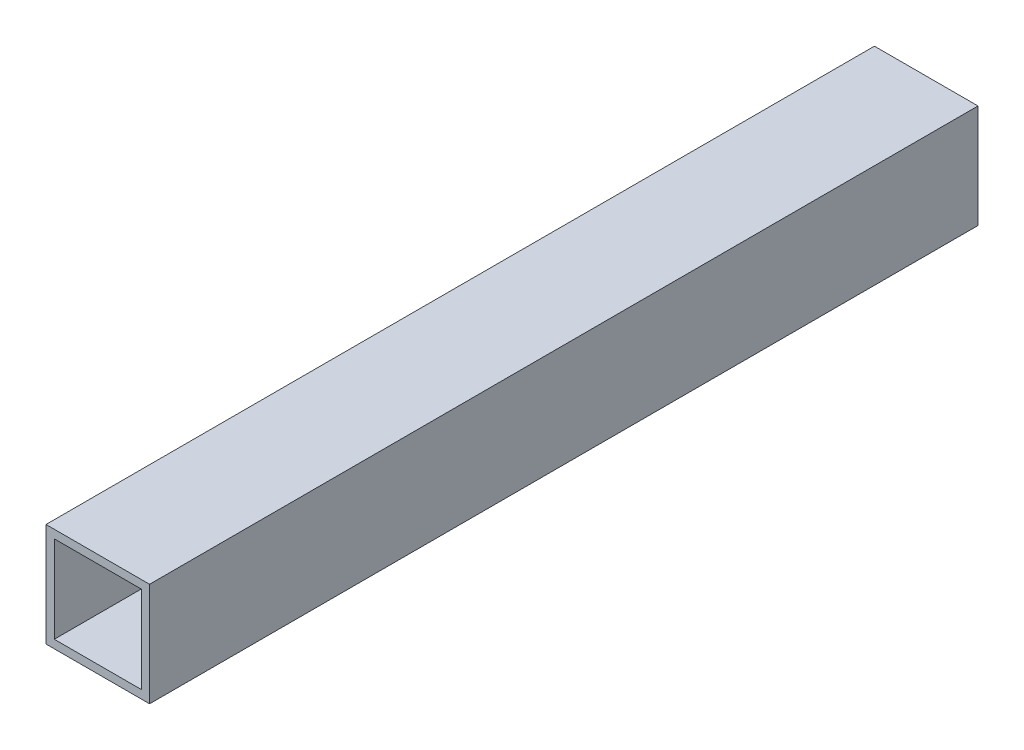
ISO-10303-21;
HEADER;
FILE_DESCRIPTION(('STEP AP214'),'2;1');
FILE_NAME('part.step','',(''),(''),'','','');
FILE_SCHEMA(('AUTOMOTIVE_DESIGN { 1 0 10303 214 1 1 1 1 }'));
ENDSEC;
DATA;
#1=APPLICATION_CONTEXT('core data for automotive mechanical design processes');
#2=APPLICATION_PROTOCOL_DEFINITION('international standard','automotive_design',2000,#1);
#3=PRODUCT_CONTEXT('',#1,'mechanical');
#4=PRODUCT('Part','Part','',(#3));
#5=PRODUCT_RELATED_PRODUCT_CATEGORY('part','',(#4));
#6=PRODUCT_DEFINITION_FORMATION('','',#4);
#7=PRODUCT_DEFINITION_CONTEXT('part definition',#1,'design');
#8=PRODUCT_DEFINITION('design','',#6,#7);
#9=PRODUCT_DEFINITION_SHAPE('','',#8);
#10=(LENGTH_UNIT() NAMED_UNIT(*) SI_UNIT(.MILLI.,.METRE.));
#11=(NAMED_UNIT(*) PLANE_ANGLE_UNIT() SI_UNIT($,.RADIAN.));
#12=(NAMED_UNIT(*) SI_UNIT($,.STERADIAN.) SOLID_ANGLE_UNIT());
#13=UNCERTAINTY_MEASURE_WITH_UNIT(LENGTH_MEASURE(1.E-05),#10,'distance_accuracy_value','');
#14=(GEOMETRIC_REPRESENTATION_CONTEXT(3) GLOBAL_UNCERTAINTY_ASSIGNED_CONTEXT((#13)) GLOBAL_UNIT_ASSIGNED_CONTEXT((#10,
#11,#12)) REPRESENTATION_CONTEXT('',''));
#15=CARTESIAN_POINT('',(0.,0.,0.));
#16=DIRECTION('',(0.,0.,1.));
#17=DIRECTION('',(1.,0.,0.));
#18=AXIS2_PLACEMENT_3D('',#15,#16,#17);
#19=CARTESIAN_POINT('',(0.,0.,200.));
#20=DIRECTION('',(0.,0.,-1.));
#21=DIRECTION('',(-1.,0.,0.));
#22=AXIS2_PLACEMENT_3D('',#19,#20,#21);
#23=PLANE('',#22);
#24=DIRECTION('',(0.,1.,0.));
#25=VECTOR('',#24,1.);
#26=CARTESIAN_POINT('',(12.5,-12.5,200.));
#27=LINE('',#26,#25);
#28=CARTESIAN_POINT('',(12.5,-12.5,200.));
#29=VERTEX_POINT('',#28);
#30=CARTESIAN_POINT('',(12.5,12.5,200.));
#31=VERTEX_POINT('',#30);
#32=EDGE_CURVE('E137',#29,#31,#27,.T.);
#33=ORIENTED_EDGE('',*,*,#32,.T.);
#34=DIRECTION('',(-1.,0.,0.));
#35=VECTOR('',#34,1.);
#36=CARTESIAN_POINT('',(-12.5,12.5,200.));
#37=LINE('',#36,#35);
#38=CARTESIAN_POINT('',(-12.5,12.5,200.));
#39=VERTEX_POINT('',#38);
#40=EDGE_CURVE('E140',#31,#39,#37,.T.);
#41=ORIENTED_EDGE('',*,*,#40,.T.);
#42=DIRECTION('',(0.,-1.,0.));
#43=VECTOR('',#42,1.);
#44=CARTESIAN_POINT('',(-12.5,-12.5,200.));
#45=LINE('',#44,#43);
#46=CARTESIAN_POINT('',(-12.5,-12.5,200.));
#47=VERTEX_POINT('',#46);
#48=EDGE_CURVE('E143',#39,#47,#45,.T.);
#49=ORIENTED_EDGE('',*,*,#48,.T.);
#50=DIRECTION('',(1.,0.,0.));
#51=VECTOR('',#50,1.);
#52=CARTESIAN_POINT('',(-12.5,-12.5,200.));
#53=LINE('',#52,#51);
#54=EDGE_CURVE('E145',#47,#29,#53,.T.);
#55=ORIENTED_EDGE('',*,*,#54,.T.);
#56=EDGE_LOOP('',(#33,#41,#49,#55));
#57=FACE_BOUND('',#56,.T.);
#58=DIRECTION('',(0.,1.,0.));
#59=VECTOR('',#58,1.);
#60=CARTESIAN_POINT('',(10.5,10.5,200.));
#61=LINE('',#60,#59);
#62=CARTESIAN_POINT('',(10.5,-10.5,200.));
#63=VERTEX_POINT('',#62);
#64=CARTESIAN_POINT('',(10.5,10.5,200.));
#65=VERTEX_POINT('',#64);
#66=EDGE_CURVE('E101',#63,#65,#61,.T.);
#67=ORIENTED_EDGE('',*,*,#66,.F.);
#68=DIRECTION('',(1.,0.,0.));
#69=VECTOR('',#68,1.);
#70=CARTESIAN_POINT('',(-10.5,-10.5,200.));
#71=LINE('',#70,#69);
#72=CARTESIAN_POINT('',(-10.5,-10.5,200.));
#73=VERTEX_POINT('',#72);
#74=EDGE_CURVE('E123',#73,#63,#71,.T.);
#75=ORIENTED_EDGE('',*,*,#74,.F.);
#76=DIRECTION('',(0.,-1.,0.));
#77=VECTOR('',#76,1.);
#78=CARTESIAN_POINT('',(-10.5,10.5,200.));
#79=LINE('',#78,#77);
#80=CARTESIAN_POINT('',(-10.5,10.5,200.));
#81=VERTEX_POINT('',#80);
#82=EDGE_CURVE('E121',#81,#73,#79,.T.);
#83=ORIENTED_EDGE('',*,*,#82,.F.);
#84=DIRECTION('',(-1.,0.,0.));
#85=VECTOR('',#84,1.);
#86=CARTESIAN_POINT('',(-10.5,10.5,200.));
#87=LINE('',#86,#85);
#88=EDGE_CURVE('E109',#65,#81,#87,.T.);
#89=ORIENTED_EDGE('',*,*,#88,.F.);
#90=EDGE_LOOP('',(#67,#75,#83,#89));
#91=FACE_BOUND('',#90,.T.);
#92=ADVANCED_FACE('F36',(#57,#91),#23,.F.);
#93=CARTESIAN_POINT('',(0.,0.,0.));
#94=DIRECTION('',(0.,0.,-1.));
#95=DIRECTION('',(-1.,0.,0.));
#96=AXIS2_PLACEMENT_3D('',#93,#94,#95);
#97=PLANE('',#96);
#98=DIRECTION('',(0.,1.,0.));
#99=VECTOR('',#98,1.);
#100=CARTESIAN_POINT('',(12.5,-12.5,0.));
#101=LINE('',#100,#99);
#102=CARTESIAN_POINT('',(12.5,-12.5,0.));
#103=VERTEX_POINT('',#102);
#104=CARTESIAN_POINT('',(12.5,12.5,0.));
#105=VERTEX_POINT('',#104);
#106=EDGE_CURVE('E117',#103,#105,#101,.T.);
#107=ORIENTED_EDGE('',*,*,#106,.F.);
#108=DIRECTION('',(1.,0.,0.));
#109=VECTOR('',#108,1.);
#110=CARTESIAN_POINT('',(-12.5,-12.5,0.));
#111=LINE('',#110,#109);
#112=CARTESIAN_POINT('',(-12.5,-12.5,0.));
#113=VERTEX_POINT('',#112);
#114=EDGE_CURVE('E141',#113,#103,#111,.T.);
#115=ORIENTED_EDGE('',*,*,#114,.F.);
#116=DIRECTION('',(0.,-1.,0.));
#117=VECTOR('',#116,1.);
#118=CARTESIAN_POINT('',(-12.5,-12.5,0.));
#119=LINE('',#118,#117);
#120=CARTESIAN_POINT('',(-12.5,12.5,0.));
#121=VERTEX_POINT('',#120);
#122=EDGE_CURVE('E152',#121,#113,#119,.T.);
#123=ORIENTED_EDGE('',*,*,#122,.F.);
#124=DIRECTION('',(-1.,0.,0.));
#125=VECTOR('',#124,1.);
#126=CARTESIAN_POINT('',(-12.5,12.5,0.));
#127=LINE('',#126,#125);
#128=EDGE_CURVE('E150',#105,#121,#127,.T.);
#129=ORIENTED_EDGE('',*,*,#128,.F.);
#130=EDGE_LOOP('',(#107,#115,#123,#129));
#131=FACE_BOUND('',#130,.T.);
#132=DIRECTION('',(1.,0.,0.));
#133=VECTOR('',#132,1.);
#134=CARTESIAN_POINT('',(-10.5,-10.5,0.));
#135=LINE('',#134,#133);
#136=CARTESIAN_POINT('',(-10.5,-10.5,0.));
#137=VERTEX_POINT('',#136);
#138=CARTESIAN_POINT('',(10.5,-10.5,0.));
#139=VERTEX_POINT('',#138);
#140=EDGE_CURVE('E110',#137,#139,#135,.T.);
#141=ORIENTED_EDGE('',*,*,#140,.T.);
#142=DIRECTION('',(0.,1.,0.));
#143=VECTOR('',#142,1.);
#144=CARTESIAN_POINT('',(10.5,10.5,0.));
#145=LINE('',#144,#143);
#146=CARTESIAN_POINT('',(10.5,10.5,0.));
#147=VERTEX_POINT('',#146);
#148=EDGE_CURVE('E59',#139,#147,#145,.T.);
#149=ORIENTED_EDGE('',*,*,#148,.T.);
#150=DIRECTION('',(-1.,0.,0.));
#151=VECTOR('',#150,1.);
#152=CARTESIAN_POINT('',(-10.5,10.5,0.));
#153=LINE('',#152,#151);
#154=CARTESIAN_POINT('',(-10.5,10.5,0.));
#155=VERTEX_POINT('',#154);
#156=EDGE_CURVE('E116',#147,#155,#153,.T.);
#157=ORIENTED_EDGE('',*,*,#156,.T.);
#158=DIRECTION('',(0.,-1.,0.));
#159=VECTOR('',#158,1.);
#160=CARTESIAN_POINT('',(-10.5,10.5,0.));
#161=LINE('',#160,#159);
#162=EDGE_CURVE('E129',#155,#137,#161,.T.);
#163=ORIENTED_EDGE('',*,*,#162,.T.);
#164=EDGE_LOOP('',(#141,#149,#157,#163));
#165=FACE_BOUND('',#164,.T.);
#166=ADVANCED_FACE('F170',(#131,#165),#97,.T.);
#167=CARTESIAN_POINT('',(12.5,-12.5,200.));
#168=DIRECTION('',(-1.,0.,0.));
#169=DIRECTION('',(0.,0.,1.));
#170=AXIS2_PLACEMENT_3D('',#167,#168,#169);
#171=PLANE('',#170);
#172=ORIENTED_EDGE('',*,*,#106,.T.);
#173=DIRECTION('',(0.,0.,-1.));
#174=VECTOR('',#173,1.);
#175=CARTESIAN_POINT('',(12.5,12.5,200.));
#176=LINE('',#175,#174);
#177=EDGE_CURVE('E11',#31,#105,#176,.T.);
#178=ORIENTED_EDGE('',*,*,#177,.F.);
#179=ORIENTED_EDGE('',*,*,#32,.F.);
#180=DIRECTION('',(0.,0.,-1.));
#181=VECTOR('',#180,1.);
#182=CARTESIAN_POINT('',(12.5,-12.5,200.));
#183=LINE('',#182,#181);
#184=EDGE_CURVE('E147',#29,#103,#183,.T.);
#185=ORIENTED_EDGE('',*,*,#184,.T.);
#186=EDGE_LOOP('',(#172,#178,#179,#185));
#187=FACE_BOUND('',#186,.T.);
#188=ADVANCED_FACE('F38',(#187),#171,.F.);
#189=CARTESIAN_POINT('',(-12.5,12.5,200.));
#190=DIRECTION('',(0.,-1.,0.));
#191=DIRECTION('',(0.,0.,-1.));
#192=AXIS2_PLACEMENT_3D('',#189,#190,#191);
#193=PLANE('',#192);
#194=ORIENTED_EDGE('',*,*,#128,.T.);
#195=DIRECTION('',(0.,0.,-1.));
#196=VECTOR('',#195,1.);
#197=CARTESIAN_POINT('',(-12.5,12.5,200.));
#198=LINE('',#197,#196);
#199=EDGE_CURVE('E44',#39,#121,#198,.T.);
#200=ORIENTED_EDGE('',*,*,#199,.F.);
#201=ORIENTED_EDGE('',*,*,#40,.F.);
#202=ORIENTED_EDGE('',*,*,#177,.T.);
#203=EDGE_LOOP('',(#194,#200,#201,#202));
#204=FACE_BOUND('',#203,.T.);
#205=ADVANCED_FACE('F180',(#204),#193,.F.);
#206=CARTESIAN_POINT('',(-12.5,-12.5,200.));
#207=DIRECTION('',(1.,0.,0.));
#208=DIRECTION('',(0.,0.,-1.));
#209=AXIS2_PLACEMENT_3D('',#206,#207,#208);
#210=PLANE('',#209);
#211=ORIENTED_EDGE('',*,*,#122,.T.);
#212=DIRECTION('',(0.,0.,-1.));
#213=VECTOR('',#212,1.);
#214=CARTESIAN_POINT('',(-12.5,-12.5,200.));
#215=LINE('',#214,#213);
#216=EDGE_CURVE('E157',#47,#113,#215,.T.);
#217=ORIENTED_EDGE('',*,*,#216,.F.);
#218=ORIENTED_EDGE('',*,*,#48,.F.);
#219=ORIENTED_EDGE('',*,*,#199,.T.);
#220=EDGE_LOOP('',(#211,#217,#218,#219));
#221=FACE_BOUND('',#220,.T.);
#222=ADVANCED_FACE('F164',(#221),#210,.F.);
#223=CARTESIAN_POINT('',(-12.5,-12.5,200.));
#224=DIRECTION('',(0.,1.,0.));
#225=DIRECTION('',(0.,0.,1.));
#226=AXIS2_PLACEMENT_3D('',#223,#224,#225);
#227=PLANE('',#226);
#228=ORIENTED_EDGE('',*,*,#114,.T.);
#229=ORIENTED_EDGE('',*,*,#184,.F.);
#230=ORIENTED_EDGE('',*,*,#54,.F.);
#231=ORIENTED_EDGE('',*,*,#216,.T.);
#232=EDGE_LOOP('',(#228,#229,#230,#231));
#233=FACE_BOUND('',#232,.T.);
#234=ADVANCED_FACE('F174',(#233),#227,.F.);
#235=CARTESIAN_POINT('',(10.5,10.5,200.));
#236=DIRECTION('',(-1.,0.,0.));
#237=DIRECTION('',(0.,0.,1.));
#238=AXIS2_PLACEMENT_3D('',#235,#236,#237);
#239=PLANE('',#238);
#240=ORIENTED_EDGE('',*,*,#148,.F.);
#241=DIRECTION('',(0.,0.,-1.));
#242=VECTOR('',#241,1.);
#243=CARTESIAN_POINT('',(10.5,-10.5,200.));
#244=LINE('',#243,#242);
#245=EDGE_CURVE('E105',#63,#139,#244,.T.);
#246=ORIENTED_EDGE('',*,*,#245,.F.);
#247=ORIENTED_EDGE('',*,*,#66,.T.);
#248=DIRECTION('',(0.,0.,-1.));
#249=VECTOR('',#248,1.);
#250=CARTESIAN_POINT('',(10.5,10.5,200.));
#251=LINE('',#250,#249);
#252=EDGE_CURVE('E104',#65,#147,#251,.T.);
#253=ORIENTED_EDGE('',*,*,#252,.T.);
#254=EDGE_LOOP('',(#240,#246,#247,#253));
#255=FACE_BOUND('',#254,.T.);
#256=ADVANCED_FACE('F103',(#255),#239,.T.);
#257=CARTESIAN_POINT('',(-10.5,10.5,200.));
#258=DIRECTION('',(0.,-1.,0.));
#259=DIRECTION('',(0.,0.,-1.));
#260=AXIS2_PLACEMENT_3D('',#257,#258,#259);
#261=PLANE('',#260);
#262=ORIENTED_EDGE('',*,*,#156,.F.);
#263=ORIENTED_EDGE('',*,*,#252,.F.);
#264=ORIENTED_EDGE('',*,*,#88,.T.);
#265=DIRECTION('',(0.,0.,-1.));
#266=VECTOR('',#265,1.);
#267=CARTESIAN_POINT('',(-10.5,10.5,200.));
#268=LINE('',#267,#266);
#269=EDGE_CURVE('E118',#81,#155,#268,.T.);
#270=ORIENTED_EDGE('',*,*,#269,.T.);
#271=EDGE_LOOP('',(#262,#263,#264,#270));
#272=FACE_BOUND('',#271,.T.);
#273=ADVANCED_FACE('F113',(#272),#261,.T.);
#274=CARTESIAN_POINT('',(-10.5,10.5,200.));
#275=DIRECTION('',(1.,0.,0.));
#276=DIRECTION('',(0.,0.,-1.));
#277=AXIS2_PLACEMENT_3D('',#274,#275,#276);
#278=PLANE('',#277);
#279=ORIENTED_EDGE('',*,*,#162,.F.);
#280=ORIENTED_EDGE('',*,*,#269,.F.);
#281=ORIENTED_EDGE('',*,*,#82,.T.);
#282=DIRECTION('',(0.,0.,-1.));
#283=VECTOR('',#282,1.);
#284=CARTESIAN_POINT('',(-10.5,-10.5,200.));
#285=LINE('',#284,#283);
#286=EDGE_CURVE('E51',#73,#137,#285,.T.);
#287=ORIENTED_EDGE('',*,*,#286,.T.);
#288=EDGE_LOOP('',(#279,#280,#281,#287));
#289=FACE_BOUND('',#288,.T.);
#290=ADVANCED_FACE('F203',(#289),#278,.T.);
#291=CARTESIAN_POINT('',(-10.5,-10.5,200.));
#292=DIRECTION('',(0.,1.,0.));
#293=DIRECTION('',(0.,0.,1.));
#294=AXIS2_PLACEMENT_3D('',#291,#292,#293);
#295=PLANE('',#294);
#296=ORIENTED_EDGE('',*,*,#140,.F.);
#297=ORIENTED_EDGE('',*,*,#286,.F.);
#298=ORIENTED_EDGE('',*,*,#74,.T.);
#299=ORIENTED_EDGE('',*,*,#245,.T.);
#300=EDGE_LOOP('',(#296,#297,#298,#299));
#301=FACE_BOUND('',#300,.T.);
#302=ADVANCED_FACE('F207',(#301),#295,.T.);
#303=CLOSED_SHELL('',(#92,#166,#188,#205,#222,#234,#256,#273,#290,#302));
#304=MANIFOLD_SOLID_BREP('B2',#303);
#305=ADVANCED_BREP_SHAPE_REPRESENTATION('',(#18,#304),#14);
#306=SHAPE_DEFINITION_REPRESENTATION(#9,#305);
ENDSEC;
END-ISO-10303-21;
